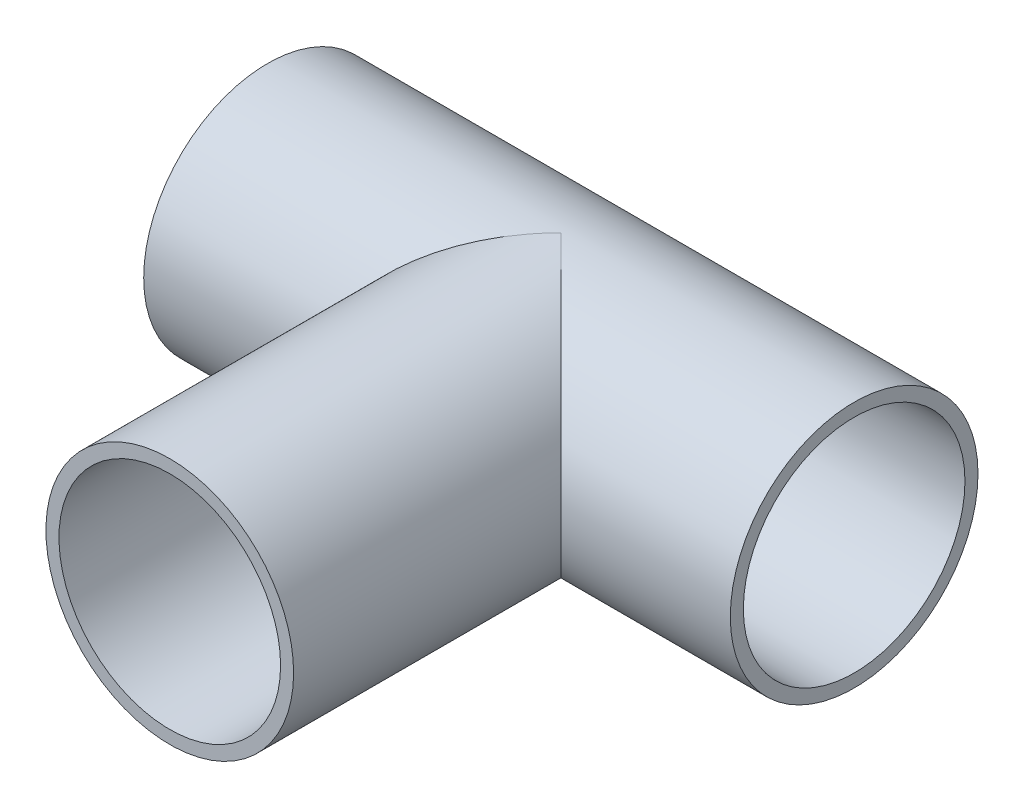
ISO-10303-21;
HEADER;
FILE_DESCRIPTION(('STEP AP214'),'2;1');
FILE_NAME('part.step','',(''),(''),'','','');
FILE_SCHEMA(('AUTOMOTIVE_DESIGN { 1 0 10303 214 1 1 1 1 }'));
ENDSEC;
DATA;
#1=APPLICATION_CONTEXT('core data for automotive mechanical design processes');
#2=APPLICATION_PROTOCOL_DEFINITION('international standard','automotive_design',2000,#1);
#3=PRODUCT_CONTEXT('',#1,'mechanical');
#4=PRODUCT('Part','Part','',(#3));
#5=PRODUCT_RELATED_PRODUCT_CATEGORY('part','',(#4));
#6=PRODUCT_DEFINITION_FORMATION('','',#4);
#7=PRODUCT_DEFINITION_CONTEXT('part definition',#1,'design');
#8=PRODUCT_DEFINITION('design','',#6,#7);
#9=PRODUCT_DEFINITION_SHAPE('','',#8);
#10=(LENGTH_UNIT() NAMED_UNIT(*) SI_UNIT(.MILLI.,.METRE.));
#11=(NAMED_UNIT(*) PLANE_ANGLE_UNIT() SI_UNIT($,.RADIAN.));
#12=(NAMED_UNIT(*) SI_UNIT($,.STERADIAN.) SOLID_ANGLE_UNIT());
#13=UNCERTAINTY_MEASURE_WITH_UNIT(LENGTH_MEASURE(1.E-05),#10,'distance_accuracy_value','');
#14=(GEOMETRIC_REPRESENTATION_CONTEXT(3) GLOBAL_UNCERTAINTY_ASSIGNED_CONTEXT((#13)) GLOBAL_UNIT_ASSIGNED_CONTEXT((#10,
#11,#12)) REPRESENTATION_CONTEXT('',''));
#15=CARTESIAN_POINT('',(0.,0.,0.));
#16=DIRECTION('',(0.,0.,1.));
#17=DIRECTION('',(1.,0.,0.));
#18=AXIS2_PLACEMENT_3D('',#15,#16,#17);
#19=CARTESIAN_POINT('',(0.,0.,0.));
#20=DIRECTION('',(0.,0.,-1.));
#21=DIRECTION('',(-1.,0.,0.));
#22=AXIS2_PLACEMENT_3D('',#19,#20,#21);
#23=CYLINDRICAL_SURFACE('',#22,19.);
#24=CARTESIAN_POINT('',(0.,0.,0.));
#25=DIRECTION('',(0.,0.,1.));
#26=DIRECTION('',(1.,0.,0.));
#27=AXIS2_PLACEMENT_3D('',#24,#25,#26);
#28=CIRCLE('',#27,19.);
#29=CARTESIAN_POINT('',(19.,0.,0.));
#30=VERTEX_POINT('',#29);
#31=EDGE_CURVE('E80',#30,#30,#28,.T.);
#32=ORIENTED_EDGE('',*,*,#31,.F.);
#33=EDGE_LOOP('',(#32));
#34=FACE_BOUND('',#33,.T.);
#35=CARTESIAN_POINT('',(0.,0.,-60.));
#36=DIRECTION('',(-0.707106781186548,0.,0.707106781186547));
#37=DIRECTION('',(-0.707106781186547,0.,-0.707106781186548));
#38=AXIS2_PLACEMENT_3D('',#35,#36,#37);
#39=ELLIPSE('',#38,26.8700576850888,19.);
#40=CARTESIAN_POINT('',(0.,-19.,-60.));
#41=VERTEX_POINT('',#40);
#42=CARTESIAN_POINT('',(0.,19.,-60.));
#43=VERTEX_POINT('',#42);
#44=EDGE_CURVE('E58',#41,#43,#39,.T.);
#45=ORIENTED_EDGE('',*,*,#44,.T.);
#46=CARTESIAN_POINT('',(0.,0.,-60.));
#47=DIRECTION('',(-0.707106781186548,0.,-0.707106781186547));
#48=DIRECTION('',(0.707106781186547,0.,-0.707106781186548));
#49=AXIS2_PLACEMENT_3D('',#46,#47,#48);
#50=ELLIPSE('',#49,26.8700576850888,19.);
#51=EDGE_CURVE('E39',#41,#43,#50,.T.);
#52=ORIENTED_EDGE('',*,*,#51,.F.);
#53=EDGE_LOOP('',(#45,#52));
#54=FACE_BOUND('',#53,.T.);
#55=ADVANCED_FACE('F35',(#34,#54),#23,.T.);
#56=CARTESIAN_POINT('',(21.,0.,-60.));
#57=DIRECTION('',(-1.,0.,0.));
#58=DIRECTION('',(0.,0.,1.));
#59=AXIS2_PLACEMENT_3D('',#56,#57,#58);
#60=CYLINDRICAL_SURFACE('',#59,19.);
#61=ORIENTED_EDGE('',*,*,#44,.F.);
#62=ORIENTED_EDGE('',*,*,#51,.T.);
#63=EDGE_LOOP('',(#61,#62));
#64=FACE_BOUND('',#63,.T.);
#65=CARTESIAN_POINT('',(45.,0.,-60.));
#66=DIRECTION('',(1.,0.,0.));
#67=DIRECTION('',(0.,0.,-1.));
#68=AXIS2_PLACEMENT_3D('',#65,#66,#67);
#69=CIRCLE('',#68,19.);
#70=CARTESIAN_POINT('',(45.,0.,-79.));
#71=VERTEX_POINT('',#70);
#72=EDGE_CURVE('E70',#71,#71,#69,.T.);
#73=ORIENTED_EDGE('',*,*,#72,.F.);
#74=EDGE_LOOP('',(#73));
#75=FACE_BOUND('',#74,.T.);
#76=CARTESIAN_POINT('',(-45.,0.,-60.));
#77=DIRECTION('',(1.,0.,0.));
#78=DIRECTION('',(0.,0.,-1.));
#79=AXIS2_PLACEMENT_3D('',#76,#77,#78);
#80=CIRCLE('',#79,19.);
#81=CARTESIAN_POINT('',(-45.,0.,-79.));
#82=VERTEX_POINT('',#81);
#83=EDGE_CURVE('E82',#82,#82,#80,.T.);
#84=ORIENTED_EDGE('',*,*,#83,.T.);
#85=EDGE_LOOP('',(#84));
#86=FACE_BOUND('',#85,.T.);
#87=ADVANCED_FACE('F37',(#64,#75,#86),#60,.T.);
#88=CARTESIAN_POINT('',(-45.,0.,-60.));
#89=DIRECTION('',(1.,0.,0.));
#90=DIRECTION('',(0.,0.,-1.));
#91=AXIS2_PLACEMENT_3D('',#88,#89,#90);
#92=PLANE('',#91);
#93=CARTESIAN_POINT('',(-45.,0.,-60.));
#94=DIRECTION('',(1.,0.,0.));
#95=DIRECTION('',(0.,0.,-1.));
#96=AXIS2_PLACEMENT_3D('',#93,#94,#95);
#97=CIRCLE('',#96,17.);
#98=CARTESIAN_POINT('',(-45.,0.,-77.));
#99=VERTEX_POINT('',#98);
#100=EDGE_CURVE('E44',#99,#99,#97,.F.);
#101=ORIENTED_EDGE('',*,*,#100,.F.);
#102=EDGE_LOOP('',(#101));
#103=FACE_BOUND('',#102,.T.);
#104=ORIENTED_EDGE('',*,*,#83,.F.);
#105=EDGE_LOOP('',(#104));
#106=FACE_BOUND('',#105,.T.);
#107=ADVANCED_FACE('F93',(#103,#106),#92,.F.);
#108=CARTESIAN_POINT('',(0.,0.,0.));
#109=DIRECTION('',(0.,0.,1.));
#110=DIRECTION('',(1.,0.,0.));
#111=AXIS2_PLACEMENT_3D('',#108,#109,#110);
#112=PLANE('',#111);
#113=CARTESIAN_POINT('',(0.,0.,0.));
#114=DIRECTION('',(0.,0.,1.));
#115=DIRECTION('',(1.,0.,0.));
#116=AXIS2_PLACEMENT_3D('',#113,#114,#115);
#117=CIRCLE('',#116,17.);
#118=CARTESIAN_POINT('',(17.,0.,0.));
#119=VERTEX_POINT('',#118);
#120=EDGE_CURVE('E11',#119,#119,#117,.F.);
#121=ORIENTED_EDGE('',*,*,#120,.T.);
#122=EDGE_LOOP('',(#121));
#123=FACE_BOUND('',#122,.T.);
#124=ORIENTED_EDGE('',*,*,#31,.T.);
#125=EDGE_LOOP('',(#124));
#126=FACE_BOUND('',#125,.T.);
#127=ADVANCED_FACE('F98',(#123,#126),#112,.T.);
#128=CARTESIAN_POINT('',(0.,0.,0.));
#129=DIRECTION('',(0.,0.,-1.));
#130=DIRECTION('',(-1.,0.,0.));
#131=AXIS2_PLACEMENT_3D('',#128,#129,#130);
#132=CYLINDRICAL_SURFACE('',#131,17.);
#133=ORIENTED_EDGE('',*,*,#120,.F.);
#134=EDGE_LOOP('',(#133));
#135=FACE_BOUND('',#134,.T.);
#136=CARTESIAN_POINT('',(0.,0.,-60.));
#137=DIRECTION('',(-0.707106781186547,0.,-0.707106781186548));
#138=DIRECTION('',(0.707106781186547,0.,-0.707106781186548));
#139=AXIS2_PLACEMENT_3D('',#136,#137,#138);
#140=ELLIPSE('',#139,24.0416305603426,17.);
#141=CARTESIAN_POINT('',(0.,-17.,-60.));
#142=VERTEX_POINT('',#141);
#143=CARTESIAN_POINT('',(0.,17.,-60.));
#144=VERTEX_POINT('',#143);
#145=EDGE_CURVE('E63',#142,#144,#140,.T.);
#146=ORIENTED_EDGE('',*,*,#145,.T.);
#147=CARTESIAN_POINT('',(0.,0.,-60.));
#148=DIRECTION('',(0.707106781186547,0.,-0.707106781186548));
#149=DIRECTION('',(-0.707106781186547,0.,-0.707106781186548));
#150=AXIS2_PLACEMENT_3D('',#147,#148,#149);
#151=ELLIPSE('',#150,24.0416305603426,17.);
#152=EDGE_CURVE('E51',#144,#142,#151,.T.);
#153=ORIENTED_EDGE('',*,*,#152,.T.);
#154=EDGE_LOOP('',(#146,#153));
#155=FACE_BOUND('',#154,.T.);
#156=ADVANCED_FACE('F68',(#135,#155),#132,.F.);
#157=CARTESIAN_POINT('',(45.,0.,-60.));
#158=DIRECTION('',(-1.,0.,0.));
#159=DIRECTION('',(0.,0.,-1.));
#160=AXIS2_PLACEMENT_3D('',#157,#158,#159);
#161=PLANE('',#160);
#162=CARTESIAN_POINT('',(45.,0.,-60.));
#163=DIRECTION('',(1.,0.,0.));
#164=DIRECTION('',(0.,0.,-1.));
#165=AXIS2_PLACEMENT_3D('',#162,#163,#164);
#166=CIRCLE('',#165,17.);
#167=CARTESIAN_POINT('',(45.,0.,-77.));
#168=VERTEX_POINT('',#167);
#169=EDGE_CURVE('E73',#168,#168,#166,.F.);
#170=ORIENTED_EDGE('',*,*,#169,.T.);
#171=EDGE_LOOP('',(#170));
#172=FACE_BOUND('',#171,.T.);
#173=ORIENTED_EDGE('',*,*,#72,.T.);
#174=EDGE_LOOP('',(#173));
#175=FACE_BOUND('',#174,.T.);
#176=ADVANCED_FACE('F94',(#172,#175),#161,.F.);
#177=CARTESIAN_POINT('',(18.8,0.,-60.));
#178=DIRECTION('',(-1.,0.,0.));
#179=DIRECTION('',(0.,0.,1.));
#180=AXIS2_PLACEMENT_3D('',#177,#178,#179);
#181=CYLINDRICAL_SURFACE('',#180,17.);
#182=ORIENTED_EDGE('',*,*,#152,.F.);
#183=ORIENTED_EDGE('',*,*,#145,.F.);
#184=EDGE_LOOP('',(#182,#183));
#185=FACE_BOUND('',#184,.T.);
#186=ORIENTED_EDGE('',*,*,#169,.F.);
#187=EDGE_LOOP('',(#186));
#188=FACE_BOUND('',#187,.T.);
#189=ORIENTED_EDGE('',*,*,#100,.T.);
#190=EDGE_LOOP('',(#189));
#191=FACE_BOUND('',#190,.T.);
#192=ADVANCED_FACE('F64',(#185,#188,#191),#181,.F.);
#193=CLOSED_SHELL('',(#55,#87,#107,#127,#156,#176,#192));
#194=MANIFOLD_SOLID_BREP('B2',#193);
#195=ADVANCED_BREP_SHAPE_REPRESENTATION('',(#18,#194),#14);
#196=SHAPE_DEFINITION_REPRESENTATION(#9,#195);
ENDSEC;
END-ISO-10303-21;
